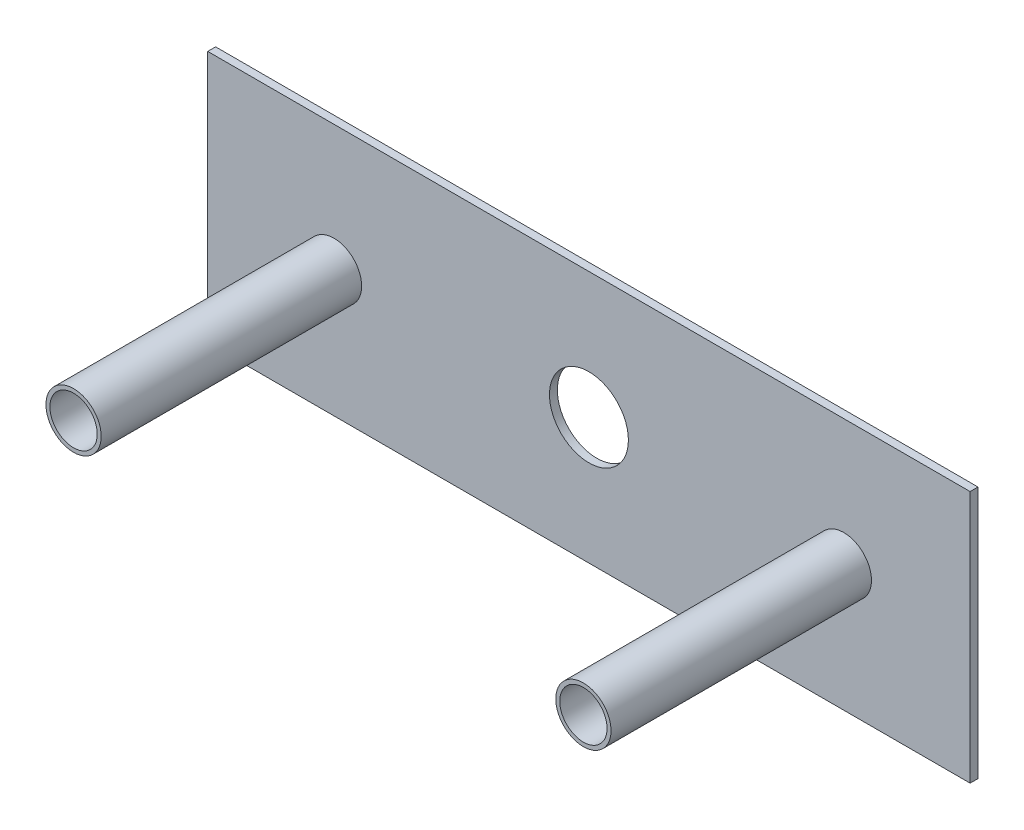
ISO-10303-21;
HEADER;
FILE_DESCRIPTION(('STEP AP214'),'2;1');
FILE_NAME('part.step','',(''),(''),'','','');
FILE_SCHEMA(('AUTOMOTIVE_DESIGN { 1 0 10303 214 1 1 1 1 }'));
ENDSEC;
DATA;
#1=APPLICATION_CONTEXT('core data for automotive mechanical design processes');
#2=APPLICATION_PROTOCOL_DEFINITION('international standard','automotive_design',2000,#1);
#3=PRODUCT_CONTEXT('',#1,'mechanical');
#4=PRODUCT('Part','Part','',(#3));
#5=PRODUCT_RELATED_PRODUCT_CATEGORY('part','',(#4));
#6=PRODUCT_DEFINITION_FORMATION('','',#4);
#7=PRODUCT_DEFINITION_CONTEXT('part definition',#1,'design');
#8=PRODUCT_DEFINITION('design','',#6,#7);
#9=PRODUCT_DEFINITION_SHAPE('','',#8);
#10=(LENGTH_UNIT() NAMED_UNIT(*) SI_UNIT(.MILLI.,.METRE.));
#11=(NAMED_UNIT(*) PLANE_ANGLE_UNIT() SI_UNIT($,.RADIAN.));
#12=(NAMED_UNIT(*) SI_UNIT($,.STERADIAN.) SOLID_ANGLE_UNIT());
#13=UNCERTAINTY_MEASURE_WITH_UNIT(LENGTH_MEASURE(1.E-05),#10,'distance_accuracy_value','');
#14=(GEOMETRIC_REPRESENTATION_CONTEXT(3) GLOBAL_UNCERTAINTY_ASSIGNED_CONTEXT((#13)) GLOBAL_UNIT_ASSIGNED_CONTEXT((#10,
#11,#12)) REPRESENTATION_CONTEXT('',''));
#15=CARTESIAN_POINT('',(0.,0.,0.));
#16=DIRECTION('',(0.,0.,1.));
#17=DIRECTION('',(1.,0.,0.));
#18=AXIS2_PLACEMENT_3D('',#15,#16,#17);
#19=CARTESIAN_POINT('',(-47.6288432611678,18.259938231017,1.));
#20=DIRECTION('',(1.,0.,0.));
#21=DIRECTION('',(0.,0.,-1.));
#22=AXIS2_PLACEMENT_3D('',#19,#20,#21);
#23=PLANE('',#22);
#24=DIRECTION('',(0.,-1.,0.));
#25=VECTOR('',#24,1.);
#26=CARTESIAN_POINT('',(-47.6288432611678,18.259938231017,0.));
#27=LINE('',#26,#25);
#28=CARTESIAN_POINT('',(-47.6288432611678,18.259938231017,0.));
#29=VERTEX_POINT('',#28);
#30=CARTESIAN_POINT('',(-47.6288432611678,-13.740061768983,0.));
#31=VERTEX_POINT('',#30);
#32=EDGE_CURVE('E96',#29,#31,#27,.T.);
#33=ORIENTED_EDGE('',*,*,#32,.T.);
#34=DIRECTION('',(0.,0.,-1.));
#35=VECTOR('',#34,1.);
#36=CARTESIAN_POINT('',(-47.6288432611678,-13.740061768983,1.));
#37=LINE('',#36,#35);
#38=CARTESIAN_POINT('',(-47.6288432611678,-13.740061768983,1.));
#39=VERTEX_POINT('',#38);
#40=EDGE_CURVE('E11',#39,#31,#37,.T.);
#41=ORIENTED_EDGE('',*,*,#40,.F.);
#42=DIRECTION('',(0.,-1.,0.));
#43=VECTOR('',#42,1.);
#44=CARTESIAN_POINT('',(-47.6288432611678,18.259938231017,1.));
#45=LINE('',#44,#43);
#46=CARTESIAN_POINT('',(-47.6288432611678,18.259938231017,1.));
#47=VERTEX_POINT('',#46);
#48=EDGE_CURVE('E84',#47,#39,#45,.T.);
#49=ORIENTED_EDGE('',*,*,#48,.F.);
#50=DIRECTION('',(0.,0.,-1.));
#51=VECTOR('',#50,1.);
#52=CARTESIAN_POINT('',(-47.6288432611678,18.259938231017,1.));
#53=LINE('',#52,#51);
#54=EDGE_CURVE('E92',#47,#29,#53,.T.);
#55=ORIENTED_EDGE('',*,*,#54,.T.);
#56=EDGE_LOOP('',(#33,#41,#49,#55));
#57=FACE_BOUND('',#56,.T.);
#58=ADVANCED_FACE('F33',(#57),#23,.F.);
#59=CARTESIAN_POINT('',(-47.6288432611678,-13.740061768983,1.));
#60=DIRECTION('',(0.,1.,0.));
#61=DIRECTION('',(0.,0.,1.));
#62=AXIS2_PLACEMENT_3D('',#59,#60,#61);
#63=PLANE('',#62);
#64=DIRECTION('',(1.,0.,0.));
#65=VECTOR('',#64,1.);
#66=CARTESIAN_POINT('',(-47.6288432611678,-13.740061768983,0.));
#67=LINE('',#66,#65);
#68=CARTESIAN_POINT('',(48.9711567388322,-13.740061768983,0.));
#69=VERTEX_POINT('',#68);
#70=EDGE_CURVE('E88',#31,#69,#67,.T.);
#71=ORIENTED_EDGE('',*,*,#70,.T.);
#72=DIRECTION('',(0.,0.,-1.));
#73=VECTOR('',#72,1.);
#74=CARTESIAN_POINT('',(48.9711567388322,-13.740061768983,1.));
#75=LINE('',#74,#73);
#76=CARTESIAN_POINT('',(48.9711567388322,-13.740061768983,1.));
#77=VERTEX_POINT('',#76);
#78=EDGE_CURVE('E41',#77,#69,#75,.T.);
#79=ORIENTED_EDGE('',*,*,#78,.F.);
#80=DIRECTION('',(1.,0.,0.));
#81=VECTOR('',#80,1.);
#82=CARTESIAN_POINT('',(-47.6288432611678,-13.740061768983,1.));
#83=LINE('',#82,#81);
#84=EDGE_CURVE('E79',#39,#77,#83,.T.);
#85=ORIENTED_EDGE('',*,*,#84,.F.);
#86=ORIENTED_EDGE('',*,*,#40,.T.);
#87=EDGE_LOOP('',(#71,#79,#85,#86));
#88=FACE_BOUND('',#87,.T.);
#89=ADVANCED_FACE('F87',(#88),#63,.F.);
#90=CARTESIAN_POINT('',(48.9711567388322,18.259938231017,1.));
#91=DIRECTION('',(-1.,0.,0.));
#92=DIRECTION('',(0.,0.,1.));
#93=AXIS2_PLACEMENT_3D('',#90,#91,#92);
#94=PLANE('',#93);
#95=DIRECTION('',(0.,1.,0.));
#96=VECTOR('',#95,1.);
#97=CARTESIAN_POINT('',(48.9711567388322,18.259938231017,0.));
#98=LINE('',#97,#96);
#99=CARTESIAN_POINT('',(48.9711567388322,18.259938231017,0.));
#100=VERTEX_POINT('',#99);
#101=EDGE_CURVE('E66',#69,#100,#98,.T.);
#102=ORIENTED_EDGE('',*,*,#101,.T.);
#103=DIRECTION('',(0.,0.,-1.));
#104=VECTOR('',#103,1.);
#105=CARTESIAN_POINT('',(48.9711567388322,18.259938231017,1.));
#106=LINE('',#105,#104);
#107=CARTESIAN_POINT('',(48.9711567388322,18.259938231017,1.));
#108=VERTEX_POINT('',#107);
#109=EDGE_CURVE('E89',#108,#100,#106,.T.);
#110=ORIENTED_EDGE('',*,*,#109,.F.);
#111=DIRECTION('',(0.,1.,0.));
#112=VECTOR('',#111,1.);
#113=CARTESIAN_POINT('',(48.9711567388322,18.259938231017,1.));
#114=LINE('',#113,#112);
#115=EDGE_CURVE('E82',#77,#108,#114,.T.);
#116=ORIENTED_EDGE('',*,*,#115,.F.);
#117=ORIENTED_EDGE('',*,*,#78,.T.);
#118=EDGE_LOOP('',(#102,#110,#116,#117));
#119=FACE_BOUND('',#118,.T.);
#120=ADVANCED_FACE('F90',(#119),#94,.F.);
#121=CARTESIAN_POINT('',(-47.6288432611678,18.259938231017,1.));
#122=DIRECTION('',(0.,-1.,0.));
#123=DIRECTION('',(0.,0.,-1.));
#124=AXIS2_PLACEMENT_3D('',#121,#122,#123);
#125=PLANE('',#124);
#126=DIRECTION('',(-1.,0.,0.));
#127=VECTOR('',#126,1.);
#128=CARTESIAN_POINT('',(-47.6288432611678,18.259938231017,0.));
#129=LINE('',#128,#127);
#130=EDGE_CURVE('E72',#100,#29,#129,.T.);
#131=ORIENTED_EDGE('',*,*,#130,.T.);
#132=ORIENTED_EDGE('',*,*,#54,.F.);
#133=DIRECTION('',(-1.,0.,0.));
#134=VECTOR('',#133,1.);
#135=CARTESIAN_POINT('',(-47.6288432611678,18.259938231017,1.));
#136=LINE('',#135,#134);
#137=EDGE_CURVE('E49',#108,#47,#136,.T.);
#138=ORIENTED_EDGE('',*,*,#137,.F.);
#139=ORIENTED_EDGE('',*,*,#109,.T.);
#140=EDGE_LOOP('',(#131,#132,#138,#139));
#141=FACE_BOUND('',#140,.T.);
#142=ADVANCED_FACE('F104',(#141),#125,.F.);
#143=CARTESIAN_POINT('',(0.,0.,1.));
#144=DIRECTION('',(0.,0.,1.));
#145=DIRECTION('',(1.,0.,0.));
#146=AXIS2_PLACEMENT_3D('',#143,#144,#145);
#147=PLANE('',#146);
#148=CARTESIAN_POINT('',(0.671156738832203,2.25993823101696,1.));
#149=DIRECTION('',(0.,0.,1.));
#150=DIRECTION('',(1.,0.,0.));
#151=AXIS2_PLACEMENT_3D('',#148,#149,#150);
#152=CIRCLE('',#151,5.);
#153=CARTESIAN_POINT('',(5.6711567388322,2.25993823101696,1.));
#154=VERTEX_POINT('',#153);
#155=EDGE_CURVE('E119',#154,#154,#152,.T.);
#156=ORIENTED_EDGE('',*,*,#155,.F.);
#157=EDGE_LOOP('',(#156));
#158=FACE_BOUND('',#157,.T.);
#159=CARTESIAN_POINT('',(32.9711567388322,2.25993823101696,1.));
#160=DIRECTION('',(0.,0.,1.));
#161=DIRECTION('',(1.,0.,0.));
#162=AXIS2_PLACEMENT_3D('',#159,#160,#161);
#163=CIRCLE('',#162,3.5);
#164=CARTESIAN_POINT('',(36.4711567388322,2.25993823101696,1.));
#165=VERTEX_POINT('',#164);
#166=EDGE_CURVE('E116',#165,#165,#163,.T.);
#167=ORIENTED_EDGE('',*,*,#166,.F.);
#168=EDGE_LOOP('',(#167));
#169=FACE_BOUND('',#168,.T.);
#170=CARTESIAN_POINT('',(-31.6288432611678,2.25993823101696,1.));
#171=DIRECTION('',(0.,0.,1.));
#172=DIRECTION('',(1.,0.,0.));
#173=AXIS2_PLACEMENT_3D('',#170,#171,#172);
#174=CIRCLE('',#173,3.5);
#175=CARTESIAN_POINT('',(-28.1288432611678,2.25993823101696,1.));
#176=VERTEX_POINT('',#175);
#177=EDGE_CURVE('E110',#176,#176,#174,.T.);
#178=ORIENTED_EDGE('',*,*,#177,.F.);
#179=EDGE_LOOP('',(#178));
#180=FACE_BOUND('',#179,.T.);
#181=ORIENTED_EDGE('',*,*,#48,.T.);
#182=ORIENTED_EDGE('',*,*,#84,.T.);
#183=ORIENTED_EDGE('',*,*,#115,.T.);
#184=ORIENTED_EDGE('',*,*,#137,.T.);
#185=EDGE_LOOP('',(#181,#182,#183,#184));
#186=FACE_BOUND('',#185,.T.);
#187=ADVANCED_FACE('F80',(#158,#169,#180,#186),#147,.T.);
#188=CARTESIAN_POINT('',(0.,0.,0.));
#189=DIRECTION('',(0.,0.,1.));
#190=DIRECTION('',(1.,0.,0.));
#191=AXIS2_PLACEMENT_3D('',#188,#189,#190);
#192=PLANE('',#191);
#193=CARTESIAN_POINT('',(-31.6288432611678,2.25993823101696,0.));
#194=DIRECTION('',(0.,0.,1.));
#195=DIRECTION('',(1.,0.,0.));
#196=AXIS2_PLACEMENT_3D('',#193,#194,#195);
#197=CIRCLE('',#196,3.);
#198=CARTESIAN_POINT('',(-28.6288432611678,2.25993823101696,0.));
#199=VERTEX_POINT('',#198);
#200=EDGE_CURVE('E124',#199,#199,#197,.T.);
#201=ORIENTED_EDGE('',*,*,#200,.T.);
#202=EDGE_LOOP('',(#201));
#203=FACE_BOUND('',#202,.T.);
#204=CARTESIAN_POINT('',(32.9711567388322,2.25993823101696,0.));
#205=DIRECTION('',(0.,0.,1.));
#206=DIRECTION('',(1.,0.,0.));
#207=AXIS2_PLACEMENT_3D('',#204,#205,#206);
#208=CIRCLE('',#207,3.);
#209=CARTESIAN_POINT('',(35.9711567388322,2.25993823101696,0.));
#210=VERTEX_POINT('',#209);
#211=EDGE_CURVE('E131',#210,#210,#208,.T.);
#212=ORIENTED_EDGE('',*,*,#211,.T.);
#213=EDGE_LOOP('',(#212));
#214=FACE_BOUND('',#213,.T.);
#215=CARTESIAN_POINT('',(0.671156738832203,2.25993823101696,0.));
#216=DIRECTION('',(0.,0.,1.));
#217=DIRECTION('',(1.,0.,0.));
#218=AXIS2_PLACEMENT_3D('',#215,#216,#217);
#219=CIRCLE('',#218,5.);
#220=CARTESIAN_POINT('',(5.6711567388322,2.25993823101696,0.));
#221=VERTEX_POINT('',#220);
#222=EDGE_CURVE('E125',#221,#221,#219,.T.);
#223=ORIENTED_EDGE('',*,*,#222,.T.);
#224=EDGE_LOOP('',(#223));
#225=FACE_BOUND('',#224,.T.);
#226=ORIENTED_EDGE('',*,*,#32,.F.);
#227=ORIENTED_EDGE('',*,*,#130,.F.);
#228=ORIENTED_EDGE('',*,*,#101,.F.);
#229=ORIENTED_EDGE('',*,*,#70,.F.);
#230=EDGE_LOOP('',(#226,#227,#228,#229));
#231=FACE_BOUND('',#230,.T.);
#232=ADVANCED_FACE('F107',(#203,#214,#225,#231),#192,.F.);
#233=CARTESIAN_POINT('',(-31.6288432611678,2.25993823101696,34.));
#234=DIRECTION('',(0.,0.,-1.));
#235=DIRECTION('',(-1.,0.,0.));
#236=AXIS2_PLACEMENT_3D('',#233,#234,#235);
#237=CYLINDRICAL_SURFACE('',#236,3.5);
#238=CARTESIAN_POINT('',(-31.6288432611678,2.25993823101696,34.));
#239=DIRECTION('',(0.,0.,1.));
#240=DIRECTION('',(1.,0.,0.));
#241=AXIS2_PLACEMENT_3D('',#238,#239,#240);
#242=CIRCLE('',#241,3.5);
#243=CARTESIAN_POINT('',(-28.1288432611678,2.25993823101696,34.));
#244=VERTEX_POINT('',#243);
#245=EDGE_CURVE('E99',#244,#244,#242,.T.);
#246=ORIENTED_EDGE('',*,*,#245,.F.);
#247=EDGE_LOOP('',(#246));
#248=FACE_BOUND('',#247,.T.);
#249=ORIENTED_EDGE('',*,*,#177,.T.);
#250=EDGE_LOOP('',(#249));
#251=FACE_BOUND('',#250,.T.);
#252=ADVANCED_FACE('F154',(#248,#251),#237,.T.);
#253=CARTESIAN_POINT('',(-31.6288432611678,2.25993823101696,34.));
#254=DIRECTION('',(0.,0.,1.));
#255=DIRECTION('',(1.,0.,0.));
#256=AXIS2_PLACEMENT_3D('',#253,#254,#255);
#257=PLANE('',#256);
#258=CARTESIAN_POINT('',(-31.6288432611678,2.25993823101696,34.));
#259=DIRECTION('',(0.,0.,1.));
#260=DIRECTION('',(1.,0.,0.));
#261=AXIS2_PLACEMENT_3D('',#258,#259,#260);
#262=CIRCLE('',#261,3.);
#263=CARTESIAN_POINT('',(-28.6288432611678,2.25993823101696,34.));
#264=VERTEX_POINT('',#263);
#265=EDGE_CURVE('E134',#264,#264,#262,.T.);
#266=ORIENTED_EDGE('',*,*,#265,.F.);
#267=EDGE_LOOP('',(#266));
#268=FACE_BOUND('',#267,.T.);
#269=ORIENTED_EDGE('',*,*,#245,.T.);
#270=EDGE_LOOP('',(#269));
#271=FACE_BOUND('',#270,.T.);
#272=ADVANCED_FACE('F150',(#268,#271),#257,.T.);
#273=CARTESIAN_POINT('',(32.9711567388322,2.25993823101696,34.));
#274=DIRECTION('',(0.,0.,-1.));
#275=DIRECTION('',(-1.,0.,0.));
#276=AXIS2_PLACEMENT_3D('',#273,#274,#275);
#277=CYLINDRICAL_SURFACE('',#276,3.5);
#278=CARTESIAN_POINT('',(32.9711567388322,2.25993823101696,34.));
#279=DIRECTION('',(0.,0.,1.));
#280=DIRECTION('',(1.,0.,0.));
#281=AXIS2_PLACEMENT_3D('',#278,#279,#280);
#282=CIRCLE('',#281,3.5);
#283=CARTESIAN_POINT('',(36.4711567388322,2.25993823101696,34.));
#284=VERTEX_POINT('',#283);
#285=EDGE_CURVE('E113',#284,#284,#282,.T.);
#286=ORIENTED_EDGE('',*,*,#285,.F.);
#287=EDGE_LOOP('',(#286));
#288=FACE_BOUND('',#287,.T.);
#289=ORIENTED_EDGE('',*,*,#166,.T.);
#290=EDGE_LOOP('',(#289));
#291=FACE_BOUND('',#290,.T.);
#292=ADVANCED_FACE('F153',(#288,#291),#277,.T.);
#293=CARTESIAN_POINT('',(32.9711567388322,2.25993823101696,34.));
#294=DIRECTION('',(0.,0.,1.));
#295=DIRECTION('',(1.,0.,0.));
#296=AXIS2_PLACEMENT_3D('',#293,#294,#295);
#297=PLANE('',#296);
#298=CARTESIAN_POINT('',(32.9711567388322,2.25993823101696,34.));
#299=DIRECTION('',(0.,0.,1.));
#300=DIRECTION('',(1.,0.,0.));
#301=AXIS2_PLACEMENT_3D('',#298,#299,#300);
#302=CIRCLE('',#301,3.);
#303=CARTESIAN_POINT('',(35.9711567388322,2.25993823101696,34.));
#304=VERTEX_POINT('',#303);
#305=EDGE_CURVE('E128',#304,#304,#302,.T.);
#306=ORIENTED_EDGE('',*,*,#305,.F.);
#307=EDGE_LOOP('',(#306));
#308=FACE_BOUND('',#307,.T.);
#309=ORIENTED_EDGE('',*,*,#285,.T.);
#310=EDGE_LOOP('',(#309));
#311=FACE_BOUND('',#310,.T.);
#312=ADVANCED_FACE('F205',(#308,#311),#297,.T.);
#313=CARTESIAN_POINT('',(32.9711567388322,2.25993823101696,0.));
#314=DIRECTION('',(0.,0.,1.));
#315=DIRECTION('',(1.,0.,0.));
#316=AXIS2_PLACEMENT_3D('',#313,#314,#315);
#317=CYLINDRICAL_SURFACE('',#316,3.);
#318=ORIENTED_EDGE('',*,*,#211,.F.);
#319=EDGE_LOOP('',(#318));
#320=FACE_BOUND('',#319,.T.);
#321=ORIENTED_EDGE('',*,*,#305,.T.);
#322=EDGE_LOOP('',(#321));
#323=FACE_BOUND('',#322,.T.);
#324=ADVANCED_FACE('F146',(#320,#323),#317,.F.);
#325=CARTESIAN_POINT('',(-31.6288432611678,2.25993823101696,0.));
#326=DIRECTION('',(0.,0.,1.));
#327=DIRECTION('',(1.,0.,0.));
#328=AXIS2_PLACEMENT_3D('',#325,#326,#327);
#329=CYLINDRICAL_SURFACE('',#328,3.);
#330=ORIENTED_EDGE('',*,*,#200,.F.);
#331=EDGE_LOOP('',(#330));
#332=FACE_BOUND('',#331,.T.);
#333=ORIENTED_EDGE('',*,*,#265,.T.);
#334=EDGE_LOOP('',(#333));
#335=FACE_BOUND('',#334,.T.);
#336=ADVANCED_FACE('F142',(#332,#335),#329,.F.);
#337=CARTESIAN_POINT('',(0.671156738832203,2.25993823101696,0.));
#338=DIRECTION('',(0.,0.,1.));
#339=DIRECTION('',(1.,0.,0.));
#340=AXIS2_PLACEMENT_3D('',#337,#338,#339);
#341=CYLINDRICAL_SURFACE('',#340,5.);
#342=ORIENTED_EDGE('',*,*,#155,.T.);
#343=EDGE_LOOP('',(#342));
#344=FACE_BOUND('',#343,.T.);
#345=ORIENTED_EDGE('',*,*,#222,.F.);
#346=EDGE_LOOP('',(#345));
#347=FACE_BOUND('',#346,.T.);
#348=ADVANCED_FACE('F145',(#344,#347),#341,.F.);
#349=CLOSED_SHELL('',(#58,#89,#120,#142,#187,#232,#252,#272,#292,#312,#324,#336,#348));
#350=MANIFOLD_SOLID_BREP('B2',#349);
#351=ADVANCED_BREP_SHAPE_REPRESENTATION('',(#18,#350),#14);
#352=SHAPE_DEFINITION_REPRESENTATION(#9,#351);
ENDSEC;
END-ISO-10303-21;
